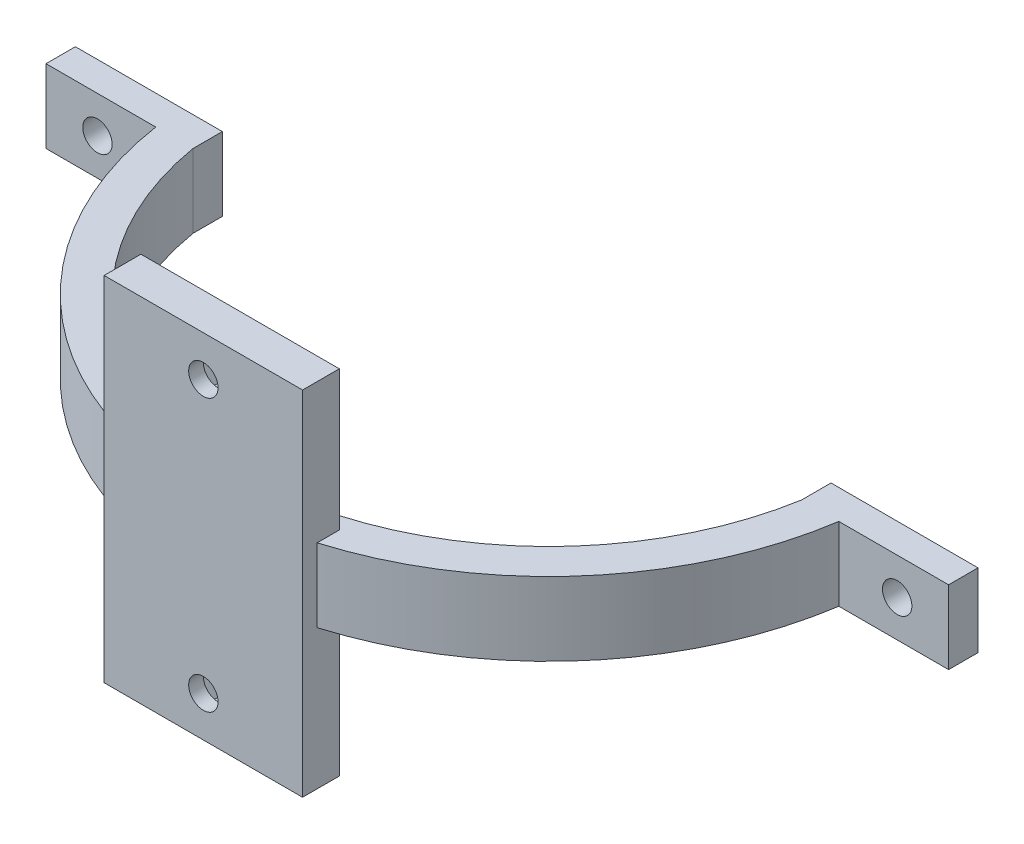
ISO-10303-21;
HEADER;
FILE_DESCRIPTION(('STEP AP214'),'2;1');
FILE_NAME('part.step','',(''),(''),'','','');
FILE_SCHEMA(('AUTOMOTIVE_DESIGN { 1 0 10303 214 1 1 1 1 }'));
ENDSEC;
DATA;
#1=APPLICATION_CONTEXT('core data for automotive mechanical design processes');
#2=APPLICATION_PROTOCOL_DEFINITION('international standard','automotive_design',2000,#1);
#3=PRODUCT_CONTEXT('',#1,'mechanical');
#4=PRODUCT('Part','Part','',(#3));
#5=PRODUCT_RELATED_PRODUCT_CATEGORY('part','',(#4));
#6=PRODUCT_DEFINITION_FORMATION('','',#4);
#7=PRODUCT_DEFINITION_CONTEXT('part definition',#1,'design');
#8=PRODUCT_DEFINITION('design','',#6,#7);
#9=PRODUCT_DEFINITION_SHAPE('','',#8);
#10=(LENGTH_UNIT() NAMED_UNIT(*) SI_UNIT(.MILLI.,.METRE.));
#11=(NAMED_UNIT(*) PLANE_ANGLE_UNIT() SI_UNIT($,.RADIAN.));
#12=(NAMED_UNIT(*) SI_UNIT($,.STERADIAN.) SOLID_ANGLE_UNIT());
#13=UNCERTAINTY_MEASURE_WITH_UNIT(LENGTH_MEASURE(1.E-05),#10,'distance_accuracy_value','');
#14=(GEOMETRIC_REPRESENTATION_CONTEXT(3) GLOBAL_UNCERTAINTY_ASSIGNED_CONTEXT((#13)) GLOBAL_UNIT_ASSIGNED_CONTEXT((#10,
#11,#12)) REPRESENTATION_CONTEXT('',''));
#15=CARTESIAN_POINT('',(0.,0.,0.));
#16=DIRECTION('',(0.,0.,1.));
#17=DIRECTION('',(1.,0.,0.));
#18=AXIS2_PLACEMENT_3D('',#15,#16,#17);
#19=CARTESIAN_POINT('',(0.,10.,0.));
#20=DIRECTION('',(0.,1.,0.));
#21=DIRECTION('',(0.,0.,1.));
#22=AXIS2_PLACEMENT_3D('',#19,#20,#21);
#23=PLANE('',#22);
#24=DIRECTION('',(0.,0.,1.));
#25=VECTOR('',#24,1.);
#26=CARTESIAN_POINT('',(-13.5,10.,47.));
#27=LINE('',#26,#25);
#28=CARTESIAN_POINT('',(-13.5,10.,42.));
#29=VERTEX_POINT('',#28);
#30=CARTESIAN_POINT('',(-13.5,10.,45.0194402452985));
#31=VERTEX_POINT('',#30);
#32=EDGE_CURVE('E334',#29,#31,#27,.T.);
#33=ORIENTED_EDGE('',*,*,#32,.F.);
#34=DIRECTION('',(-1.,0.,0.));
#35=VECTOR('',#34,1.);
#36=CARTESIAN_POINT('',(-13.5,10.,42.));
#37=LINE('',#36,#35);
#38=CARTESIAN_POINT('',(0.,10.,42.));
#39=VERTEX_POINT('',#38);
#40=EDGE_CURVE('E11',#39,#29,#37,.T.);
#41=ORIENTED_EDGE('',*,*,#40,.F.);
#42=CARTESIAN_POINT('',(0.,10.,0.));
#43=DIRECTION('',(0.,1.,0.));
#44=DIRECTION('',(0.,0.,1.));
#45=AXIS2_PLACEMENT_3D('',#42,#43,#44);
#46=CIRCLE('',#45,42.);
#47=CARTESIAN_POINT('',(-41.4125584816973,10.,6.99999999999999));
#48=VERTEX_POINT('',#47);
#49=EDGE_CURVE('E549',#48,#39,#46,.T.);
#50=ORIENTED_EDGE('',*,*,#49,.F.);
#51=DIRECTION('',(0.,0.,1.));
#52=VECTOR('',#51,1.);
#53=CARTESIAN_POINT('',(-41.4125584816973,10.,3.));
#54=LINE('',#53,#52);
#55=CARTESIAN_POINT('',(-41.4125584816973,10.,3.));
#56=VERTEX_POINT('',#55);
#57=EDGE_CURVE('E554',#56,#48,#54,.T.);
#58=ORIENTED_EDGE('',*,*,#57,.F.);
#59=DIRECTION('',(1.,0.,0.));
#60=VECTOR('',#59,1.);
#61=CARTESIAN_POINT('',(61.4125584816973,10.,3.));
#62=LINE('',#61,#60);
#63=CARTESIAN_POINT('',(-61.4125584816973,10.,3.));
#64=VERTEX_POINT('',#63);
#65=EDGE_CURVE('E503',#64,#56,#62,.T.);
#66=ORIENTED_EDGE('',*,*,#65,.F.);
#67=DIRECTION('',(0.,0.,1.));
#68=VECTOR('',#67,1.);
#69=CARTESIAN_POINT('',(-61.4125584816973,10.,3.));
#70=LINE('',#69,#68);
#71=CARTESIAN_POINT('',(-61.4125584816973,10.,7.));
#72=VERTEX_POINT('',#71);
#73=EDGE_CURVE('E446',#64,#72,#70,.T.);
#74=ORIENTED_EDGE('',*,*,#73,.T.);
#75=DIRECTION('',(1.,0.,0.));
#76=VECTOR('',#75,1.);
#77=CARTESIAN_POINT('',(61.4125584816973,10.,7.));
#78=LINE('',#77,#76);
#79=CARTESIAN_POINT('',(-46.475800154489,10.,7.));
#80=VERTEX_POINT('',#79);
#81=EDGE_CURVE('E428',#72,#80,#78,.T.);
#82=ORIENTED_EDGE('',*,*,#81,.T.);
#83=CARTESIAN_POINT('',(0.,10.,0.));
#84=DIRECTION('',(0.,1.,0.));
#85=DIRECTION('',(0.,0.,1.));
#86=AXIS2_PLACEMENT_3D('',#83,#84,#85);
#87=CIRCLE('',#86,47.);
#88=EDGE_CURVE('E456',#80,#31,#87,.T.);
#89=ORIENTED_EDGE('',*,*,#88,.T.);
#90=EDGE_LOOP('',(#33,#41,#50,#58,#66,#74,#82,#89));
#91=FACE_BOUND('',#90,.T.);
#92=ADVANCED_FACE('F33',(#91),#23,.T.);
#93=CARTESIAN_POINT('',(0.,0.,0.));
#94=DIRECTION('',(0.,1.,0.));
#95=DIRECTION('',(0.,0.,1.));
#96=AXIS2_PLACEMENT_3D('',#93,#94,#95);
#97=PLANE('',#96);
#98=CARTESIAN_POINT('',(0.,0.,0.));
#99=DIRECTION('',(0.,1.,0.));
#100=DIRECTION('',(0.,0.,1.));
#101=AXIS2_PLACEMENT_3D('',#98,#99,#100);
#102=CIRCLE('',#101,42.);
#103=CARTESIAN_POINT('',(0.,0.,42.));
#104=VERTEX_POINT('',#103);
#105=CARTESIAN_POINT('',(41.4125584816973,0.,6.99999999999998));
#106=VERTEX_POINT('',#105);
#107=EDGE_CURVE('E542',#104,#106,#102,.T.);
#108=ORIENTED_EDGE('',*,*,#107,.T.);
#109=DIRECTION('',(0.,0.,-1.));
#110=VECTOR('',#109,1.);
#111=CARTESIAN_POINT('',(41.4125584816973,0.,0.));
#112=LINE('',#111,#110);
#113=CARTESIAN_POINT('',(41.4125584816973,0.,3.));
#114=VERTEX_POINT('',#113);
#115=EDGE_CURVE('E497',#106,#114,#112,.T.);
#116=ORIENTED_EDGE('',*,*,#115,.T.);
#117=DIRECTION('',(-1.,0.,0.));
#118=VECTOR('',#117,1.);
#119=CARTESIAN_POINT('',(-61.4125584816973,0.,3.));
#120=LINE('',#119,#118);
#121=CARTESIAN_POINT('',(61.4125584816973,0.,3.));
#122=VERTEX_POINT('',#121);
#123=EDGE_CURVE('E441',#122,#114,#120,.T.);
#124=ORIENTED_EDGE('',*,*,#123,.F.);
#125=DIRECTION('',(0.,0.,1.));
#126=VECTOR('',#125,1.);
#127=CARTESIAN_POINT('',(61.4125584816973,0.,3.));
#128=LINE('',#127,#126);
#129=CARTESIAN_POINT('',(61.4125584816973,0.,7.));
#130=VERTEX_POINT('',#129);
#131=EDGE_CURVE('E440',#122,#130,#128,.T.);
#132=ORIENTED_EDGE('',*,*,#131,.T.);
#133=DIRECTION('',(-1.,0.,0.));
#134=VECTOR('',#133,1.);
#135=CARTESIAN_POINT('',(-61.4125584816973,0.,7.));
#136=LINE('',#135,#134);
#137=CARTESIAN_POINT('',(46.475800154489,0.,7.));
#138=VERTEX_POINT('',#137);
#139=EDGE_CURVE('E422',#130,#138,#136,.T.);
#140=ORIENTED_EDGE('',*,*,#139,.T.);
#141=CARTESIAN_POINT('',(0.,0.,0.));
#142=DIRECTION('',(0.,1.,0.));
#143=DIRECTION('',(0.,0.,1.));
#144=AXIS2_PLACEMENT_3D('',#141,#142,#143);
#145=CIRCLE('',#144,47.);
#146=CARTESIAN_POINT('',(13.5,0.,45.0194402452985));
#147=VERTEX_POINT('',#146);
#148=EDGE_CURVE('E473',#147,#138,#145,.T.);
#149=ORIENTED_EDGE('',*,*,#148,.F.);
#150=DIRECTION('',(0.,0.,1.));
#151=VECTOR('',#150,1.);
#152=CARTESIAN_POINT('',(13.5,0.,47.));
#153=LINE('',#152,#151);
#154=CARTESIAN_POINT('',(13.5,0.,42.));
#155=VERTEX_POINT('',#154);
#156=EDGE_CURVE('E492',#155,#147,#153,.T.);
#157=ORIENTED_EDGE('',*,*,#156,.F.);
#158=DIRECTION('',(1.,0.,0.));
#159=VECTOR('',#158,1.);
#160=CARTESIAN_POINT('',(13.5,0.,42.));
#161=LINE('',#160,#159);
#162=EDGE_CURVE('E496',#104,#155,#161,.T.);
#163=ORIENTED_EDGE('',*,*,#162,.F.);
#164=EDGE_LOOP('',(#108,#116,#124,#132,#140,#149,#157,#163));
#165=FACE_BOUND('',#164,.T.);
#166=ADVANCED_FACE('F583',(#165),#97,.F.);
#167=CARTESIAN_POINT('',(0.,0.,3.));
#168=DIRECTION('',(0.,0.,1.));
#169=DIRECTION('',(1.,0.,0.));
#170=AXIS2_PLACEMENT_3D('',#167,#168,#169);
#171=PLANE('',#170);
#172=CARTESIAN_POINT('',(54.4125584816973,5.,3.));
#173=DIRECTION('',(0.,0.,1.));
#174=DIRECTION('',(1.,0.,0.));
#175=AXIS2_PLACEMENT_3D('',#172,#173,#174);
#176=CIRCLE('',#175,1.99999999999999);
#177=CARTESIAN_POINT('',(56.4125584816973,5.,3.));
#178=VERTEX_POINT('',#177);
#179=EDGE_CURVE('E385',#178,#178,#176,.T.);
#180=ORIENTED_EDGE('',*,*,#179,.T.);
#181=EDGE_LOOP('',(#180));
#182=FACE_BOUND('',#181,.T.);
#183=ORIENTED_EDGE('',*,*,#123,.T.);
#184=DIRECTION('',(0.,1.,0.));
#185=VECTOR('',#184,1.);
#186=CARTESIAN_POINT('',(41.4125584816973,0.,3.));
#187=LINE('',#186,#185);
#188=CARTESIAN_POINT('',(41.4125584816973,10.,3.));
#189=VERTEX_POINT('',#188);
#190=EDGE_CURVE('E369',#114,#189,#187,.T.);
#191=ORIENTED_EDGE('',*,*,#190,.T.);
#192=CARTESIAN_POINT('',(61.4125584816973,10.,3.));
#193=VERTEX_POINT('',#192);
#194=EDGE_CURVE('E502',#189,#193,#62,.T.);
#195=ORIENTED_EDGE('',*,*,#194,.T.);
#196=DIRECTION('',(0.,-1.,0.));
#197=VECTOR('',#196,1.);
#198=CARTESIAN_POINT('',(61.4125584816973,0.,3.));
#199=LINE('',#198,#197);
#200=EDGE_CURVE('E506',#193,#122,#199,.T.);
#201=ORIENTED_EDGE('',*,*,#200,.T.);
#202=EDGE_LOOP('',(#183,#191,#195,#201));
#203=FACE_BOUND('',#202,.T.);
#204=ADVANCED_FACE('F569',(#182,#203),#171,.F.);
#205=DIRECTION('',(0.,0.,1.));
#206=VECTOR('',#205,1.);
#207=CARTESIAN_POINT('',(-41.4125584816973,0.,0.));
#208=LINE('',#207,#206);
#209=CARTESIAN_POINT('',(-41.4125584816973,0.,3.));
#210=VERTEX_POINT('',#209);
#211=CARTESIAN_POINT('',(-41.4125584816973,0.,6.99999999999999));
#212=VERTEX_POINT('',#211);
#213=EDGE_CURVE('E539',#210,#212,#208,.T.);
#214=ORIENTED_EDGE('',*,*,#213,.T.);
#215=EDGE_CURVE('E543',#212,#104,#102,.T.);
#216=ORIENTED_EDGE('',*,*,#215,.T.);
#217=CARTESIAN_POINT('',(-13.5,0.,42.));
#218=VERTEX_POINT('',#217);
#219=EDGE_CURVE('E528',#218,#104,#161,.T.);
#220=ORIENTED_EDGE('',*,*,#219,.F.);
#221=DIRECTION('',(0.,0.,-1.));
#222=VECTOR('',#221,1.);
#223=CARTESIAN_POINT('',(-13.5,0.,42.));
#224=LINE('',#223,#222);
#225=CARTESIAN_POINT('',(-13.5,0.,45.0194402452985));
#226=VERTEX_POINT('',#225);
#227=EDGE_CURVE('E467',#226,#218,#224,.T.);
#228=ORIENTED_EDGE('',*,*,#227,.F.);
#229=CARTESIAN_POINT('',(0.,0.,0.));
#230=DIRECTION('',(0.,1.,0.));
#231=DIRECTION('',(0.,0.,1.));
#232=AXIS2_PLACEMENT_3D('',#229,#230,#231);
#233=CIRCLE('',#232,47.);
#234=CARTESIAN_POINT('',(-46.475800154489,0.,7.));
#235=VERTEX_POINT('',#234);
#236=EDGE_CURVE('E470',#235,#226,#233,.T.);
#237=ORIENTED_EDGE('',*,*,#236,.F.);
#238=CARTESIAN_POINT('',(-61.4125584816973,0.,7.));
#239=VERTEX_POINT('',#238);
#240=EDGE_CURVE('E413',#235,#239,#136,.T.);
#241=ORIENTED_EDGE('',*,*,#240,.T.);
#242=DIRECTION('',(0.,0.,1.));
#243=VECTOR('',#242,1.);
#244=CARTESIAN_POINT('',(-61.4125584816973,0.,3.));
#245=LINE('',#244,#243);
#246=CARTESIAN_POINT('',(-61.4125584816973,0.,3.));
#247=VERTEX_POINT('',#246);
#248=EDGE_CURVE('E437',#247,#239,#245,.T.);
#249=ORIENTED_EDGE('',*,*,#248,.F.);
#250=EDGE_CURVE('E508',#210,#247,#120,.T.);
#251=ORIENTED_EDGE('',*,*,#250,.F.);
#252=EDGE_LOOP('',(#214,#216,#220,#228,#237,#241,#249,#251));
#253=FACE_BOUND('',#252,.T.);
#254=ADVANCED_FACE('F629',(#253),#97,.F.);
#255=CARTESIAN_POINT('',(0.,0.,0.));
#256=DIRECTION('',(0.,1.,0.));
#257=DIRECTION('',(0.,0.,1.));
#258=AXIS2_PLACEMENT_3D('',#255,#256,#257);
#259=CYLINDRICAL_SURFACE('',#258,47.);
#260=ORIENTED_EDGE('',*,*,#88,.F.);
#261=DIRECTION('',(0.,1.,0.));
#262=VECTOR('',#261,1.);
#263=CARTESIAN_POINT('',(-46.475800154489,0.,7.));
#264=LINE('',#263,#262);
#265=EDGE_CURVE('E414',#235,#80,#264,.T.);
#266=ORIENTED_EDGE('',*,*,#265,.F.);
#267=ORIENTED_EDGE('',*,*,#236,.T.);
#268=DIRECTION('',(0.,1.,0.));
#269=VECTOR('',#268,1.);
#270=CARTESIAN_POINT('',(-13.5,0.,45.0194402452985));
#271=LINE('',#270,#269);
#272=EDGE_CURVE('E480',#226,#31,#271,.T.);
#273=ORIENTED_EDGE('',*,*,#272,.T.);
#274=EDGE_LOOP('',(#260,#266,#267,#273));
#275=FACE_BOUND('',#274,.T.);
#276=ADVANCED_FACE('F35',(#275),#259,.T.);
#277=CARTESIAN_POINT('',(0.,0.,0.));
#278=DIRECTION('',(0.,1.,0.));
#279=DIRECTION('',(0.,0.,1.));
#280=AXIS2_PLACEMENT_3D('',#277,#278,#279);
#281=CYLINDRICAL_SURFACE('',#280,47.);
#282=CARTESIAN_POINT('',(0.,10.,0.));
#283=DIRECTION('',(0.,1.,0.));
#284=DIRECTION('',(0.,0.,1.));
#285=AXIS2_PLACEMENT_3D('',#282,#283,#284);
#286=CIRCLE('',#285,47.);
#287=CARTESIAN_POINT('',(13.5,10.,45.0194402452985));
#288=VERTEX_POINT('',#287);
#289=CARTESIAN_POINT('',(46.475800154489,10.,7.));
#290=VERTEX_POINT('',#289);
#291=EDGE_CURVE('E474',#288,#290,#286,.T.);
#292=ORIENTED_EDGE('',*,*,#291,.F.);
#293=DIRECTION('',(0.,1.,0.));
#294=VECTOR('',#293,1.);
#295=CARTESIAN_POINT('',(13.5,0.,45.0194402452985));
#296=LINE('',#295,#294);
#297=EDGE_CURVE('E478',#147,#288,#296,.T.);
#298=ORIENTED_EDGE('',*,*,#297,.F.);
#299=ORIENTED_EDGE('',*,*,#148,.T.);
#300=DIRECTION('',(0.,1.,0.));
#301=VECTOR('',#300,1.);
#302=CARTESIAN_POINT('',(46.475800154489,0.,7.));
#303=LINE('',#302,#301);
#304=EDGE_CURVE('E468',#138,#290,#303,.T.);
#305=ORIENTED_EDGE('',*,*,#304,.T.);
#306=EDGE_LOOP('',(#292,#298,#299,#305));
#307=FACE_BOUND('',#306,.T.);
#308=ADVANCED_FACE('F607',(#307),#281,.T.);
#309=CARTESIAN_POINT('',(13.5,10.,42.));
#310=VERTEX_POINT('',#309);
#311=EDGE_CURVE('E44',#310,#39,#37,.T.);
#312=ORIENTED_EDGE('',*,*,#311,.F.);
#313=DIRECTION('',(0.,0.,-1.));
#314=VECTOR('',#313,1.);
#315=CARTESIAN_POINT('',(13.5,10.,42.));
#316=LINE('',#315,#314);
#317=EDGE_CURVE('E42',#288,#310,#316,.T.);
#318=ORIENTED_EDGE('',*,*,#317,.F.);
#319=ORIENTED_EDGE('',*,*,#291,.T.);
#320=CARTESIAN_POINT('',(61.4125584816973,10.,7.));
#321=VERTEX_POINT('',#320);
#322=EDGE_CURVE('E458',#290,#321,#78,.T.);
#323=ORIENTED_EDGE('',*,*,#322,.T.);
#324=DIRECTION('',(0.,0.,1.));
#325=VECTOR('',#324,1.);
#326=CARTESIAN_POINT('',(61.4125584816973,10.,3.));
#327=LINE('',#326,#325);
#328=EDGE_CURVE('E444',#193,#321,#327,.T.);
#329=ORIENTED_EDGE('',*,*,#328,.F.);
#330=ORIENTED_EDGE('',*,*,#194,.F.);
#331=DIRECTION('',(0.,0.,-1.));
#332=VECTOR('',#331,1.);
#333=CARTESIAN_POINT('',(41.4125584816973,10.,6.99999999999999));
#334=LINE('',#333,#332);
#335=CARTESIAN_POINT('',(41.4125584816973,10.,6.99999999999998));
#336=VERTEX_POINT('',#335);
#337=EDGE_CURVE('E361',#336,#189,#334,.T.);
#338=ORIENTED_EDGE('',*,*,#337,.F.);
#339=EDGE_CURVE('E553',#39,#336,#46,.T.);
#340=ORIENTED_EDGE('',*,*,#339,.F.);
#341=EDGE_LOOP('',(#312,#318,#319,#323,#329,#330,#338,#340));
#342=FACE_BOUND('',#341,.T.);
#343=ADVANCED_FACE('F573',(#342),#23,.T.);
#344=CARTESIAN_POINT('',(13.5,10.,47.));
#345=DIRECTION('',(-1.,0.,0.));
#346=DIRECTION('',(0.,0.,1.));
#347=AXIS2_PLACEMENT_3D('',#344,#345,#346);
#348=PLANE('',#347);
#349=ORIENTED_EDGE('',*,*,#297,.T.);
#350=ORIENTED_EDGE('',*,*,#317,.T.);
#351=DIRECTION('',(0.,-1.,0.));
#352=VECTOR('',#351,1.);
#353=CARTESIAN_POINT('',(13.5,29.,42.));
#354=LINE('',#353,#352);
#355=CARTESIAN_POINT('',(13.5,29.,42.));
#356=VERTEX_POINT('',#355);
#357=EDGE_CURVE('E358',#356,#310,#354,.T.);
#358=ORIENTED_EDGE('',*,*,#357,.F.);
#359=DIRECTION('',(0.,0.,-1.));
#360=VECTOR('',#359,1.);
#361=CARTESIAN_POINT('',(13.5,29.,42.));
#362=LINE('',#361,#360);
#363=CARTESIAN_POINT('',(13.5,29.,47.));
#364=VERTEX_POINT('',#363);
#365=EDGE_CURVE('E350',#364,#356,#362,.T.);
#366=ORIENTED_EDGE('',*,*,#365,.F.);
#367=DIRECTION('',(0.,1.,0.));
#368=VECTOR('',#367,1.);
#369=CARTESIAN_POINT('',(13.5,10.,47.));
#370=LINE('',#369,#368);
#371=CARTESIAN_POINT('',(13.5,-19.,47.));
#372=VERTEX_POINT('',#371);
#373=EDGE_CURVE('E448',#372,#364,#370,.T.);
#374=ORIENTED_EDGE('',*,*,#373,.F.);
#375=DIRECTION('',(0.,0.,1.));
#376=VECTOR('',#375,1.);
#377=CARTESIAN_POINT('',(13.5,-19.,47.));
#378=LINE('',#377,#376);
#379=CARTESIAN_POINT('',(13.5,-19.,42.));
#380=VERTEX_POINT('',#379);
#381=EDGE_CURVE('E529',#380,#372,#378,.T.);
#382=ORIENTED_EDGE('',*,*,#381,.F.);
#383=DIRECTION('',(0.,1.,0.));
#384=VECTOR('',#383,1.);
#385=CARTESIAN_POINT('',(13.5,-19.,42.));
#386=LINE('',#385,#384);
#387=EDGE_CURVE('E515',#380,#155,#386,.T.);
#388=ORIENTED_EDGE('',*,*,#387,.T.);
#389=ORIENTED_EDGE('',*,*,#156,.T.);
#390=EDGE_LOOP('',(#349,#350,#358,#366,#374,#382,#388,#389));
#391=FACE_BOUND('',#390,.T.);
#392=ADVANCED_FACE('F591',(#391),#348,.F.);
#393=CARTESIAN_POINT('',(-13.5,0.,47.));
#394=DIRECTION('',(1.,0.,0.));
#395=DIRECTION('',(0.,0.,-1.));
#396=AXIS2_PLACEMENT_3D('',#393,#394,#395);
#397=PLANE('',#396);
#398=ORIENTED_EDGE('',*,*,#272,.F.);
#399=ORIENTED_EDGE('',*,*,#227,.T.);
#400=DIRECTION('',(0.,1.,0.));
#401=VECTOR('',#400,1.);
#402=CARTESIAN_POINT('',(-13.5,-19.,42.));
#403=LINE('',#402,#401);
#404=CARTESIAN_POINT('',(-13.5,-19.,42.));
#405=VERTEX_POINT('',#404);
#406=EDGE_CURVE('E498',#405,#218,#403,.T.);
#407=ORIENTED_EDGE('',*,*,#406,.F.);
#408=DIRECTION('',(0.,0.,-1.));
#409=VECTOR('',#408,1.);
#410=CARTESIAN_POINT('',(-13.5,-19.,42.));
#411=LINE('',#410,#409);
#412=CARTESIAN_POINT('',(-13.5,-19.,47.));
#413=VERTEX_POINT('',#412);
#414=EDGE_CURVE('E525',#413,#405,#411,.T.);
#415=ORIENTED_EDGE('',*,*,#414,.F.);
#416=DIRECTION('',(0.,-1.,0.));
#417=VECTOR('',#416,1.);
#418=CARTESIAN_POINT('',(-13.5,0.,47.));
#419=LINE('',#418,#417);
#420=CARTESIAN_POINT('',(-13.5,29.,47.));
#421=VERTEX_POINT('',#420);
#422=EDGE_CURVE('E451',#421,#413,#419,.T.);
#423=ORIENTED_EDGE('',*,*,#422,.F.);
#424=DIRECTION('',(0.,0.,1.));
#425=VECTOR('',#424,1.);
#426=CARTESIAN_POINT('',(-13.5,29.,47.));
#427=LINE('',#426,#425);
#428=CARTESIAN_POINT('',(-13.5,29.,42.));
#429=VERTEX_POINT('',#428);
#430=EDGE_CURVE('E344',#429,#421,#427,.T.);
#431=ORIENTED_EDGE('',*,*,#430,.F.);
#432=DIRECTION('',(0.,-1.,0.));
#433=VECTOR('',#432,1.);
#434=CARTESIAN_POINT('',(-13.5,29.,42.));
#435=LINE('',#434,#433);
#436=EDGE_CURVE('E353',#429,#29,#435,.T.);
#437=ORIENTED_EDGE('',*,*,#436,.T.);
#438=ORIENTED_EDGE('',*,*,#32,.T.);
#439=EDGE_LOOP('',(#398,#399,#407,#415,#423,#431,#437,#438));
#440=FACE_BOUND('',#439,.T.);
#441=ADVANCED_FACE('F617',(#440),#397,.F.);
#442=CARTESIAN_POINT('',(0.,0.,47.));
#443=DIRECTION('',(0.,0.,-1.));
#444=DIRECTION('',(-1.,0.,0.));
#445=AXIS2_PLACEMENT_3D('',#442,#443,#444);
#446=PLANE('',#445);
#447=CARTESIAN_POINT('',(0.,23.5,47.));
#448=DIRECTION('',(0.,0.,1.));
#449=DIRECTION('',(1.,0.,0.));
#450=AXIS2_PLACEMENT_3D('',#447,#448,#449);
#451=CIRCLE('',#450,1.99999999999999);
#452=CARTESIAN_POINT('',(1.99999999999998,23.5,47.));
#453=VERTEX_POINT('',#452);
#454=EDGE_CURVE('E381',#453,#453,#451,.T.);
#455=ORIENTED_EDGE('',*,*,#454,.F.);
#456=EDGE_LOOP('',(#455));
#457=FACE_BOUND('',#456,.T.);
#458=CARTESIAN_POINT('',(0.,-13.5,47.));
#459=DIRECTION('',(0.,0.,1.));
#460=DIRECTION('',(1.,0.,0.));
#461=AXIS2_PLACEMENT_3D('',#458,#459,#460);
#462=CIRCLE('',#461,1.99999999999999);
#463=CARTESIAN_POINT('',(1.99999999999999,-13.5,47.));
#464=VERTEX_POINT('',#463);
#465=EDGE_CURVE('E266',#464,#464,#462,.T.);
#466=ORIENTED_EDGE('',*,*,#465,.F.);
#467=EDGE_LOOP('',(#466));
#468=FACE_BOUND('',#467,.T.);
#469=ORIENTED_EDGE('',*,*,#373,.T.);
#470=DIRECTION('',(1.,0.,0.));
#471=VECTOR('',#470,1.);
#472=CARTESIAN_POINT('',(13.5,29.,47.));
#473=LINE('',#472,#471);
#474=EDGE_CURVE('E347',#421,#364,#473,.T.);
#475=ORIENTED_EDGE('',*,*,#474,.F.);
#476=ORIENTED_EDGE('',*,*,#422,.T.);
#477=DIRECTION('',(-1.,0.,0.));
#478=VECTOR('',#477,1.);
#479=CARTESIAN_POINT('',(-13.5,-19.,47.));
#480=LINE('',#479,#478);
#481=EDGE_CURVE('E532',#372,#413,#480,.T.);
#482=ORIENTED_EDGE('',*,*,#481,.F.);
#483=EDGE_LOOP('',(#469,#475,#476,#482));
#484=FACE_BOUND('',#483,.T.);
#485=ADVANCED_FACE('F599',(#457,#468,#484),#446,.F.);
#486=CARTESIAN_POINT('',(0.,0.,7.));
#487=DIRECTION('',(0.,0.,1.));
#488=DIRECTION('',(1.,0.,0.));
#489=AXIS2_PLACEMENT_3D('',#486,#487,#488);
#490=PLANE('',#489);
#491=CARTESIAN_POINT('',(54.4125584816973,5.,7.));
#492=DIRECTION('',(0.,0.,1.));
#493=DIRECTION('',(1.,0.,0.));
#494=AXIS2_PLACEMENT_3D('',#491,#492,#493);
#495=CIRCLE('',#494,1.99999999999999);
#496=CARTESIAN_POINT('',(56.4125584816973,5.,7.));
#497=VERTEX_POINT('',#496);
#498=EDGE_CURVE('E389',#497,#497,#495,.T.);
#499=ORIENTED_EDGE('',*,*,#498,.F.);
#500=EDGE_LOOP('',(#499));
#501=FACE_BOUND('',#500,.T.);
#502=ORIENTED_EDGE('',*,*,#304,.F.);
#503=ORIENTED_EDGE('',*,*,#139,.F.);
#504=DIRECTION('',(0.,-1.,0.));
#505=VECTOR('',#504,1.);
#506=CARTESIAN_POINT('',(61.4125584816973,0.,7.));
#507=LINE('',#506,#505);
#508=EDGE_CURVE('E423',#321,#130,#507,.T.);
#509=ORIENTED_EDGE('',*,*,#508,.F.);
#510=ORIENTED_EDGE('',*,*,#322,.F.);
#511=EDGE_LOOP('',(#502,#503,#509,#510));
#512=FACE_BOUND('',#511,.T.);
#513=ADVANCED_FACE('F409',(#501,#512),#490,.T.);
#514=CARTESIAN_POINT('',(-61.4125584816973,10.,3.));
#515=DIRECTION('',(1.,0.,0.));
#516=DIRECTION('',(0.,0.,-1.));
#517=AXIS2_PLACEMENT_3D('',#514,#515,#516);
#518=PLANE('',#517);
#519=DIRECTION('',(0.,1.,0.));
#520=VECTOR('',#519,1.);
#521=CARTESIAN_POINT('',(-61.4125584816973,10.,7.));
#522=LINE('',#521,#520);
#523=EDGE_CURVE('E417',#239,#72,#522,.T.);
#524=ORIENTED_EDGE('',*,*,#523,.T.);
#525=ORIENTED_EDGE('',*,*,#73,.F.);
#526=DIRECTION('',(0.,1.,0.));
#527=VECTOR('',#526,1.);
#528=CARTESIAN_POINT('',(-61.4125584816973,10.,3.));
#529=LINE('',#528,#527);
#530=EDGE_CURVE('E426',#247,#64,#529,.T.);
#531=ORIENTED_EDGE('',*,*,#530,.F.);
#532=ORIENTED_EDGE('',*,*,#248,.T.);
#533=EDGE_LOOP('',(#524,#525,#531,#532));
#534=FACE_BOUND('',#533,.T.);
#535=ADVANCED_FACE('F610',(#534),#518,.F.);
#536=CARTESIAN_POINT('',(61.4125584816973,0.,3.));
#537=DIRECTION('',(-1.,0.,0.));
#538=DIRECTION('',(0.,0.,1.));
#539=AXIS2_PLACEMENT_3D('',#536,#537,#538);
#540=PLANE('',#539);
#541=ORIENTED_EDGE('',*,*,#508,.T.);
#542=ORIENTED_EDGE('',*,*,#131,.F.);
#543=ORIENTED_EDGE('',*,*,#200,.F.);
#544=ORIENTED_EDGE('',*,*,#328,.T.);
#545=EDGE_LOOP('',(#541,#542,#543,#544));
#546=FACE_BOUND('',#545,.T.);
#547=ADVANCED_FACE('F579',(#546),#540,.F.);
#548=CARTESIAN_POINT('',(-54.4125584816973,5.,3.));
#549=DIRECTION('',(0.,0.,1.));
#550=DIRECTION('',(1.,0.,0.));
#551=AXIS2_PLACEMENT_3D('',#548,#549,#550);
#552=CIRCLE('',#551,1.99999999999999);
#553=CARTESIAN_POINT('',(-52.4125584816973,5.,3.));
#554=VERTEX_POINT('',#553);
#555=EDGE_CURVE('E394',#554,#554,#552,.T.);
#556=ORIENTED_EDGE('',*,*,#555,.T.);
#557=EDGE_LOOP('',(#556));
#558=FACE_BOUND('',#557,.T.);
#559=ORIENTED_EDGE('',*,*,#65,.T.);
#560=DIRECTION('',(0.,-1.,0.));
#561=VECTOR('',#560,1.);
#562=CARTESIAN_POINT('',(-41.4125584816973,0.,3.));
#563=LINE('',#562,#561);
#564=EDGE_CURVE('E572',#56,#210,#563,.T.);
#565=ORIENTED_EDGE('',*,*,#564,.T.);
#566=ORIENTED_EDGE('',*,*,#250,.T.);
#567=ORIENTED_EDGE('',*,*,#530,.T.);
#568=EDGE_LOOP('',(#559,#565,#566,#567));
#569=FACE_BOUND('',#568,.T.);
#570=ADVANCED_FACE('F407',(#558,#569),#171,.F.);
#571=CARTESIAN_POINT('',(-54.4125584816973,5.,7.));
#572=DIRECTION('',(0.,0.,1.));
#573=DIRECTION('',(1.,0.,0.));
#574=AXIS2_PLACEMENT_3D('',#571,#572,#573);
#575=CIRCLE('',#574,1.99999999999999);
#576=CARTESIAN_POINT('',(-52.4125584816973,5.,7.));
#577=VERTEX_POINT('',#576);
#578=EDGE_CURVE('E397',#577,#577,#575,.T.);
#579=ORIENTED_EDGE('',*,*,#578,.F.);
#580=EDGE_LOOP('',(#579));
#581=FACE_BOUND('',#580,.T.);
#582=ORIENTED_EDGE('',*,*,#240,.F.);
#583=ORIENTED_EDGE('',*,*,#265,.T.);
#584=ORIENTED_EDGE('',*,*,#81,.F.);
#585=ORIENTED_EDGE('',*,*,#523,.F.);
#586=EDGE_LOOP('',(#582,#583,#584,#585));
#587=FACE_BOUND('',#586,.T.);
#588=ADVANCED_FACE('F403',(#581,#587),#490,.T.);
#589=CARTESIAN_POINT('',(13.5,-19.,42.));
#590=DIRECTION('',(0.,0.,1.));
#591=DIRECTION('',(1.,0.,0.));
#592=AXIS2_PLACEMENT_3D('',#589,#590,#591);
#593=PLANE('',#592);
#594=DIRECTION('',(1.,0.,0.));
#595=VECTOR('',#594,1.);
#596=CARTESIAN_POINT('',(-1.99185842870421,-10.05,42.));
#597=LINE('',#596,#595);
#598=CARTESIAN_POINT('',(-1.99185842870421,-10.05,42.));
#599=VERTEX_POINT('',#598);
#600=CARTESIAN_POINT('',(1.99185842870421,-10.05,42.));
#601=VERTEX_POINT('',#600);
#602=EDGE_CURVE('E277',#599,#601,#597,.T.);
#603=ORIENTED_EDGE('',*,*,#602,.F.);
#604=DIRECTION('',(0.5,0.866025403784439,0.));
#605=VECTOR('',#604,1.);
#606=CARTESIAN_POINT('',(-3.98371685740842,-13.5,42.));
#607=LINE('',#606,#605);
#608=CARTESIAN_POINT('',(-3.98371685740842,-13.5,42.));
#609=VERTEX_POINT('',#608);
#610=EDGE_CURVE('E51',#609,#599,#607,.T.);
#611=ORIENTED_EDGE('',*,*,#610,.F.);
#612=DIRECTION('',(-0.5,0.866025403784439,0.));
#613=VECTOR('',#612,1.);
#614=CARTESIAN_POINT('',(-1.99185842870421,-16.95,42.));
#615=LINE('',#614,#613);
#616=CARTESIAN_POINT('',(-1.99185842870421,-16.95,42.));
#617=VERTEX_POINT('',#616);
#618=EDGE_CURVE('E260',#617,#609,#615,.T.);
#619=ORIENTED_EDGE('',*,*,#618,.F.);
#620=DIRECTION('',(-1.,0.,0.));
#621=VECTOR('',#620,1.);
#622=CARTESIAN_POINT('',(1.99185842870421,-16.95,42.));
#623=LINE('',#622,#621);
#624=CARTESIAN_POINT('',(1.99185842870421,-16.95,42.));
#625=VERTEX_POINT('',#624);
#626=EDGE_CURVE('E263',#625,#617,#623,.T.);
#627=ORIENTED_EDGE('',*,*,#626,.F.);
#628=DIRECTION('',(-0.5,-0.866025403784439,0.));
#629=VECTOR('',#628,1.);
#630=CARTESIAN_POINT('',(3.98371685740843,-13.5,42.));
#631=LINE('',#630,#629);
#632=CARTESIAN_POINT('',(3.98371685740843,-13.5,42.));
#633=VERTEX_POINT('',#632);
#634=EDGE_CURVE('E283',#633,#625,#631,.T.);
#635=ORIENTED_EDGE('',*,*,#634,.F.);
#636=DIRECTION('',(0.5,-0.866025403784439,0.));
#637=VECTOR('',#636,1.);
#638=CARTESIAN_POINT('',(1.99185842870421,-10.05,42.));
#639=LINE('',#638,#637);
#640=EDGE_CURVE('E280',#601,#633,#639,.T.);
#641=ORIENTED_EDGE('',*,*,#640,.F.);
#642=EDGE_LOOP('',(#603,#611,#619,#627,#635,#641));
#643=FACE_BOUND('',#642,.T.);
#644=ORIENTED_EDGE('',*,*,#387,.F.);
#645=DIRECTION('',(1.,0.,0.));
#646=VECTOR('',#645,1.);
#647=CARTESIAN_POINT('',(13.5,-19.,42.));
#648=LINE('',#647,#646);
#649=EDGE_CURVE('E521',#405,#380,#648,.T.);
#650=ORIENTED_EDGE('',*,*,#649,.F.);
#651=ORIENTED_EDGE('',*,*,#406,.T.);
#652=ORIENTED_EDGE('',*,*,#219,.T.);
#653=ORIENTED_EDGE('',*,*,#162,.T.);
#654=EDGE_LOOP('',(#644,#650,#651,#652,#653));
#655=FACE_BOUND('',#654,.T.);
#656=ADVANCED_FACE('F406',(#643,#655),#593,.F.);
#657=CARTESIAN_POINT('',(0.,-19.,0.));
#658=DIRECTION('',(0.,1.,0.));
#659=DIRECTION('',(0.,0.,1.));
#660=AXIS2_PLACEMENT_3D('',#657,#658,#659);
#661=PLANE('',#660);
#662=ORIENTED_EDGE('',*,*,#381,.T.);
#663=ORIENTED_EDGE('',*,*,#481,.T.);
#664=ORIENTED_EDGE('',*,*,#414,.T.);
#665=ORIENTED_EDGE('',*,*,#649,.T.);
#666=EDGE_LOOP('',(#662,#663,#664,#665));
#667=FACE_BOUND('',#666,.T.);
#668=ADVANCED_FACE('F602',(#667),#661,.F.);
#669=CARTESIAN_POINT('',(41.4125584816973,-19.,6.99999999999999));
#670=DIRECTION('',(1.,0.,0.));
#671=DIRECTION('',(0.,0.,-1.));
#672=AXIS2_PLACEMENT_3D('',#669,#670,#671);
#673=PLANE('',#672);
#674=DIRECTION('',(0.,1.,0.));
#675=VECTOR('',#674,1.);
#676=CARTESIAN_POINT('',(41.4125584816973,-19.,6.99999999999998));
#677=LINE('',#676,#675);
#678=EDGE_CURVE('E546',#106,#336,#677,.T.);
#679=ORIENTED_EDGE('',*,*,#678,.T.);
#680=ORIENTED_EDGE('',*,*,#337,.T.);
#681=ORIENTED_EDGE('',*,*,#190,.F.);
#682=ORIENTED_EDGE('',*,*,#115,.F.);
#683=EDGE_LOOP('',(#679,#680,#681,#682));
#684=FACE_BOUND('',#683,.T.);
#685=ADVANCED_FACE('F563',(#684),#673,.F.);
#686=CARTESIAN_POINT('',(-41.4125584816973,-19.,3.));
#687=DIRECTION('',(-1.,0.,0.));
#688=DIRECTION('',(0.,0.,1.));
#689=AXIS2_PLACEMENT_3D('',#686,#687,#688);
#690=PLANE('',#689);
#691=ORIENTED_EDGE('',*,*,#564,.F.);
#692=ORIENTED_EDGE('',*,*,#57,.T.);
#693=DIRECTION('',(0.,1.,0.));
#694=VECTOR('',#693,1.);
#695=CARTESIAN_POINT('',(-41.4125584816973,-19.,6.99999999999999));
#696=LINE('',#695,#694);
#697=EDGE_CURVE('E547',#212,#48,#696,.T.);
#698=ORIENTED_EDGE('',*,*,#697,.F.);
#699=ORIENTED_EDGE('',*,*,#213,.F.);
#700=EDGE_LOOP('',(#691,#692,#698,#699));
#701=FACE_BOUND('',#700,.T.);
#702=ADVANCED_FACE('F657',(#701),#690,.F.);
#703=CARTESIAN_POINT('',(0.,-19.,0.));
#704=DIRECTION('',(0.,1.,0.));
#705=DIRECTION('',(0.,0.,1.));
#706=AXIS2_PLACEMENT_3D('',#703,#704,#705);
#707=CYLINDRICAL_SURFACE('',#706,42.);
#708=ORIENTED_EDGE('',*,*,#215,.F.);
#709=ORIENTED_EDGE('',*,*,#697,.T.);
#710=ORIENTED_EDGE('',*,*,#49,.T.);
#711=ORIENTED_EDGE('',*,*,#339,.T.);
#712=ORIENTED_EDGE('',*,*,#678,.F.);
#713=ORIENTED_EDGE('',*,*,#107,.F.);
#714=EDGE_LOOP('',(#708,#709,#710,#711,#712,#713));
#715=FACE_BOUND('',#714,.T.);
#716=ADVANCED_FACE('F586',(#715),#707,.F.);
#717=CARTESIAN_POINT('',(-13.5,29.,42.));
#718=DIRECTION('',(0.,0.,1.));
#719=DIRECTION('',(1.,0.,0.));
#720=AXIS2_PLACEMENT_3D('',#717,#718,#719);
#721=PLANE('',#720);
#722=DIRECTION('',(1.,0.,0.));
#723=VECTOR('',#722,1.);
#724=CARTESIAN_POINT('',(-1.99185842870421,26.95,42.));
#725=LINE('',#724,#723);
#726=CARTESIAN_POINT('',(-1.99185842870421,26.95,42.));
#727=VERTEX_POINT('',#726);
#728=CARTESIAN_POINT('',(1.99185842870421,26.95,42.));
#729=VERTEX_POINT('',#728);
#730=EDGE_CURVE('E318',#727,#729,#725,.T.);
#731=ORIENTED_EDGE('',*,*,#730,.F.);
#732=DIRECTION('',(0.5,0.866025403784439,0.));
#733=VECTOR('',#732,1.);
#734=CARTESIAN_POINT('',(-3.98371685740842,23.5,42.));
#735=LINE('',#734,#733);
#736=CARTESIAN_POINT('',(-3.98371685740842,23.5,42.));
#737=VERTEX_POINT('',#736);
#738=EDGE_CURVE('E59',#737,#727,#735,.T.);
#739=ORIENTED_EDGE('',*,*,#738,.F.);
#740=DIRECTION('',(-0.5,0.866025403784438,0.));
#741=VECTOR('',#740,1.);
#742=CARTESIAN_POINT('',(-1.99185842870421,20.05,42.));
#743=LINE('',#742,#741);
#744=CARTESIAN_POINT('',(-1.99185842870421,20.05,42.));
#745=VERTEX_POINT('',#744);
#746=EDGE_CURVE('E301',#745,#737,#743,.T.);
#747=ORIENTED_EDGE('',*,*,#746,.F.);
#748=DIRECTION('',(-1.,0.,0.));
#749=VECTOR('',#748,1.);
#750=CARTESIAN_POINT('',(1.9918584287042,20.05,42.));
#751=LINE('',#750,#749);
#752=CARTESIAN_POINT('',(1.9918584287042,20.05,42.));
#753=VERTEX_POINT('',#752);
#754=EDGE_CURVE('E327',#753,#745,#751,.T.);
#755=ORIENTED_EDGE('',*,*,#754,.F.);
#756=DIRECTION('',(-0.5,-0.866025403784439,0.));
#757=VECTOR('',#756,1.);
#758=CARTESIAN_POINT('',(3.98371685740842,23.5,42.));
#759=LINE('',#758,#757);
#760=CARTESIAN_POINT('',(3.98371685740842,23.5,42.));
#761=VERTEX_POINT('',#760);
#762=EDGE_CURVE('E324',#761,#753,#759,.T.);
#763=ORIENTED_EDGE('',*,*,#762,.F.);
#764=DIRECTION('',(0.5,-0.866025403784438,0.));
#765=VECTOR('',#764,1.);
#766=CARTESIAN_POINT('',(1.99185842870421,26.95,42.));
#767=LINE('',#766,#765);
#768=EDGE_CURVE('E321',#729,#761,#767,.T.);
#769=ORIENTED_EDGE('',*,*,#768,.F.);
#770=EDGE_LOOP('',(#731,#739,#747,#755,#763,#769));
#771=FACE_BOUND('',#770,.T.);
#772=ORIENTED_EDGE('',*,*,#311,.T.);
#773=ORIENTED_EDGE('',*,*,#40,.T.);
#774=ORIENTED_EDGE('',*,*,#436,.F.);
#775=DIRECTION('',(-1.,0.,0.));
#776=VECTOR('',#775,1.);
#777=CARTESIAN_POINT('',(-13.5,29.,42.));
#778=LINE('',#777,#776);
#779=EDGE_CURVE('E352',#356,#429,#778,.T.);
#780=ORIENTED_EDGE('',*,*,#779,.F.);
#781=ORIENTED_EDGE('',*,*,#357,.T.);
#782=EDGE_LOOP('',(#772,#773,#774,#780,#781));
#783=FACE_BOUND('',#782,.T.);
#784=ADVANCED_FACE('F594',(#771,#783),#721,.F.);
#785=CARTESIAN_POINT('',(0.,29.,0.));
#786=DIRECTION('',(0.,-1.,0.));
#787=DIRECTION('',(0.,0.,-1.));
#788=AXIS2_PLACEMENT_3D('',#785,#786,#787);
#789=PLANE('',#788);
#790=ORIENTED_EDGE('',*,*,#430,.T.);
#791=ORIENTED_EDGE('',*,*,#474,.T.);
#792=ORIENTED_EDGE('',*,*,#365,.T.);
#793=ORIENTED_EDGE('',*,*,#779,.T.);
#794=EDGE_LOOP('',(#790,#791,#792,#793));
#795=FACE_BOUND('',#794,.T.);
#796=ADVANCED_FACE('F598',(#795),#789,.F.);
#797=CARTESIAN_POINT('',(-3.98371685740842,23.5,45.));
#798=DIRECTION('',(-0.866025403784439,0.5,0.));
#799=DIRECTION('',(-0.5,-0.866025403784439,0.));
#800=AXIS2_PLACEMENT_3D('',#797,#798,#799);
#801=PLANE('',#800);
#802=ORIENTED_EDGE('',*,*,#738,.T.);
#803=DIRECTION('',(0.,0.,-1.));
#804=VECTOR('',#803,1.);
#805=CARTESIAN_POINT('',(-1.99185842870421,26.95,45.));
#806=LINE('',#805,#804);
#807=CARTESIAN_POINT('',(-1.99185842870421,26.95,45.));
#808=VERTEX_POINT('',#807);
#809=EDGE_CURVE('E316',#808,#727,#806,.T.);
#810=ORIENTED_EDGE('',*,*,#809,.F.);
#811=DIRECTION('',(0.5,0.866025403784439,0.));
#812=VECTOR('',#811,1.);
#813=CARTESIAN_POINT('',(-3.98371685740842,23.5,45.));
#814=LINE('',#813,#812);
#815=CARTESIAN_POINT('',(-3.98371685740842,23.5,45.));
#816=VERTEX_POINT('',#815);
#817=EDGE_CURVE('E297',#816,#808,#814,.T.);
#818=ORIENTED_EDGE('',*,*,#817,.F.);
#819=DIRECTION('',(0.,0.,-1.));
#820=VECTOR('',#819,1.);
#821=CARTESIAN_POINT('',(-3.98371685740842,23.5,45.));
#822=LINE('',#821,#820);
#823=EDGE_CURVE('E332',#816,#737,#822,.T.);
#824=ORIENTED_EDGE('',*,*,#823,.T.);
#825=EDGE_LOOP('',(#802,#810,#818,#824));
#826=FACE_BOUND('',#825,.T.);
#827=ADVANCED_FACE('F731',(#826),#801,.F.);
#828=CARTESIAN_POINT('',(-1.99185842870421,20.05,45.));
#829=DIRECTION('',(-0.866025403784438,-0.5,0.));
#830=DIRECTION('',(0.5,-0.866025403784439,0.));
#831=AXIS2_PLACEMENT_3D('',#828,#829,#830);
#832=PLANE('',#831);
#833=ORIENTED_EDGE('',*,*,#746,.T.);
#834=ORIENTED_EDGE('',*,*,#823,.F.);
#835=DIRECTION('',(-0.5,0.866025403784438,0.));
#836=VECTOR('',#835,1.);
#837=CARTESIAN_POINT('',(-1.99185842870421,20.05,45.));
#838=LINE('',#837,#836);
#839=CARTESIAN_POINT('',(-1.99185842870421,20.05,45.));
#840=VERTEX_POINT('',#839);
#841=EDGE_CURVE('E313',#840,#816,#838,.T.);
#842=ORIENTED_EDGE('',*,*,#841,.F.);
#843=DIRECTION('',(0.,0.,-1.));
#844=VECTOR('',#843,1.);
#845=CARTESIAN_POINT('',(-1.99185842870421,20.05,45.));
#846=LINE('',#845,#844);
#847=EDGE_CURVE('E335',#840,#745,#846,.T.);
#848=ORIENTED_EDGE('',*,*,#847,.T.);
#849=EDGE_LOOP('',(#833,#834,#842,#848));
#850=FACE_BOUND('',#849,.T.);
#851=ADVANCED_FACE('F727',(#850),#832,.F.);
#852=CARTESIAN_POINT('',(1.9918584287042,20.05,45.));
#853=DIRECTION('',(0.,-1.,0.));
#854=DIRECTION('',(0.,0.,-1.));
#855=AXIS2_PLACEMENT_3D('',#852,#853,#854);
#856=PLANE('',#855);
#857=ORIENTED_EDGE('',*,*,#754,.T.);
#858=ORIENTED_EDGE('',*,*,#847,.F.);
#859=DIRECTION('',(-1.,0.,0.));
#860=VECTOR('',#859,1.);
#861=CARTESIAN_POINT('',(1.9918584287042,20.05,45.));
#862=LINE('',#861,#860);
#863=CARTESIAN_POINT('',(1.9918584287042,20.05,45.));
#864=VERTEX_POINT('',#863);
#865=EDGE_CURVE('E310',#864,#840,#862,.T.);
#866=ORIENTED_EDGE('',*,*,#865,.F.);
#867=DIRECTION('',(0.,0.,-1.));
#868=VECTOR('',#867,1.);
#869=CARTESIAN_POINT('',(1.9918584287042,20.05,45.));
#870=LINE('',#869,#868);
#871=EDGE_CURVE('E337',#864,#753,#870,.T.);
#872=ORIENTED_EDGE('',*,*,#871,.T.);
#873=EDGE_LOOP('',(#857,#858,#866,#872));
#874=FACE_BOUND('',#873,.T.);
#875=ADVANCED_FACE('F730',(#874),#856,.F.);
#876=CARTESIAN_POINT('',(3.98371685740842,23.5,45.));
#877=DIRECTION('',(0.866025403784438,-0.5,0.));
#878=DIRECTION('',(0.5,0.866025403784439,0.));
#879=AXIS2_PLACEMENT_3D('',#876,#877,#878);
#880=PLANE('',#879);
#881=ORIENTED_EDGE('',*,*,#762,.T.);
#882=ORIENTED_EDGE('',*,*,#871,.F.);
#883=DIRECTION('',(-0.5,-0.866025403784439,0.));
#884=VECTOR('',#883,1.);
#885=CARTESIAN_POINT('',(3.98371685740842,23.5,45.));
#886=LINE('',#885,#884);
#887=CARTESIAN_POINT('',(3.98371685740842,23.5,45.));
#888=VERTEX_POINT('',#887);
#889=EDGE_CURVE('E307',#888,#864,#886,.T.);
#890=ORIENTED_EDGE('',*,*,#889,.F.);
#891=DIRECTION('',(0.,0.,-1.));
#892=VECTOR('',#891,1.);
#893=CARTESIAN_POINT('',(3.98371685740842,23.5,45.));
#894=LINE('',#893,#892);
#895=EDGE_CURVE('E339',#888,#761,#894,.T.);
#896=ORIENTED_EDGE('',*,*,#895,.T.);
#897=EDGE_LOOP('',(#881,#882,#890,#896));
#898=FACE_BOUND('',#897,.T.);
#899=ADVANCED_FACE('F735',(#898),#880,.F.);
#900=CARTESIAN_POINT('',(1.99185842870421,26.95,45.));
#901=DIRECTION('',(0.866025403784438,0.5,0.));
#902=DIRECTION('',(-0.5,0.866025403784439,0.));
#903=AXIS2_PLACEMENT_3D('',#900,#901,#902);
#904=PLANE('',#903);
#905=ORIENTED_EDGE('',*,*,#768,.T.);
#906=ORIENTED_EDGE('',*,*,#895,.F.);
#907=DIRECTION('',(0.5,-0.866025403784438,0.));
#908=VECTOR('',#907,1.);
#909=CARTESIAN_POINT('',(1.99185842870421,26.95,45.));
#910=LINE('',#909,#908);
#911=CARTESIAN_POINT('',(1.99185842870421,26.95,45.));
#912=VERTEX_POINT('',#911);
#913=EDGE_CURVE('E304',#912,#888,#910,.T.);
#914=ORIENTED_EDGE('',*,*,#913,.F.);
#915=DIRECTION('',(0.,0.,-1.));
#916=VECTOR('',#915,1.);
#917=CARTESIAN_POINT('',(1.99185842870421,26.95,45.));
#918=LINE('',#917,#916);
#919=EDGE_CURVE('E341',#912,#729,#918,.T.);
#920=ORIENTED_EDGE('',*,*,#919,.T.);
#921=EDGE_LOOP('',(#905,#906,#914,#920));
#922=FACE_BOUND('',#921,.T.);
#923=ADVANCED_FACE('F739',(#922),#904,.F.);
#924=CARTESIAN_POINT('',(-1.99185842870421,26.95,45.));
#925=DIRECTION('',(0.,1.,0.));
#926=DIRECTION('',(0.,0.,1.));
#927=AXIS2_PLACEMENT_3D('',#924,#925,#926);
#928=PLANE('',#927);
#929=ORIENTED_EDGE('',*,*,#730,.T.);
#930=ORIENTED_EDGE('',*,*,#919,.F.);
#931=DIRECTION('',(1.,0.,0.));
#932=VECTOR('',#931,1.);
#933=CARTESIAN_POINT('',(-1.99185842870421,26.95,45.));
#934=LINE('',#933,#932);
#935=EDGE_CURVE('E300',#808,#912,#934,.T.);
#936=ORIENTED_EDGE('',*,*,#935,.F.);
#937=ORIENTED_EDGE('',*,*,#809,.T.);
#938=EDGE_LOOP('',(#929,#930,#936,#937));
#939=FACE_BOUND('',#938,.T.);
#940=ADVANCED_FACE('F725',(#939),#928,.F.);
#941=CARTESIAN_POINT('',(0.,0.,45.));
#942=DIRECTION('',(0.,0.,-1.));
#943=DIRECTION('',(-1.,0.,0.));
#944=AXIS2_PLACEMENT_3D('',#941,#942,#943);
#945=PLANE('',#944);
#946=CARTESIAN_POINT('',(0.,23.5,45.));
#947=DIRECTION('',(0.,0.,-1.));
#948=DIRECTION('',(-1.,0.,0.));
#949=AXIS2_PLACEMENT_3D('',#946,#947,#948);
#950=CIRCLE('',#949,1.99999999999999);
#951=CARTESIAN_POINT('',(-1.99999999999999,23.5,45.));
#952=VERTEX_POINT('',#951);
#953=EDGE_CURVE('E37',#952,#952,#950,.T.);
#954=ORIENTED_EDGE('',*,*,#953,.F.);
#955=EDGE_LOOP('',(#954));
#956=FACE_BOUND('',#955,.T.);
#957=ORIENTED_EDGE('',*,*,#817,.T.);
#958=ORIENTED_EDGE('',*,*,#935,.T.);
#959=ORIENTED_EDGE('',*,*,#913,.T.);
#960=ORIENTED_EDGE('',*,*,#889,.T.);
#961=ORIENTED_EDGE('',*,*,#865,.T.);
#962=ORIENTED_EDGE('',*,*,#841,.T.);
#963=EDGE_LOOP('',(#957,#958,#959,#960,#961,#962));
#964=FACE_BOUND('',#963,.T.);
#965=ADVANCED_FACE('F722',(#956,#964),#945,.T.);
#966=CARTESIAN_POINT('',(-3.98371685740842,-13.5,45.));
#967=DIRECTION('',(-0.866025403784438,0.5,0.));
#968=DIRECTION('',(-0.5,-0.866025403784439,0.));
#969=AXIS2_PLACEMENT_3D('',#966,#967,#968);
#970=PLANE('',#969);
#971=ORIENTED_EDGE('',*,*,#610,.T.);
#972=DIRECTION('',(0.,0.,-1.));
#973=VECTOR('',#972,1.);
#974=CARTESIAN_POINT('',(-1.99185842870421,-10.05,45.));
#975=LINE('',#974,#973);
#976=CARTESIAN_POINT('',(-1.99185842870421,-10.05,45.));
#977=VERTEX_POINT('',#976);
#978=EDGE_CURVE('E237',#977,#599,#975,.T.);
#979=ORIENTED_EDGE('',*,*,#978,.F.);
#980=DIRECTION('',(0.5,0.866025403784439,0.));
#981=VECTOR('',#980,1.);
#982=CARTESIAN_POINT('',(-3.98371685740842,-13.5,45.));
#983=LINE('',#982,#981);
#984=CARTESIAN_POINT('',(-3.98371685740842,-13.5,45.));
#985=VERTEX_POINT('',#984);
#986=EDGE_CURVE('E241',#985,#977,#983,.T.);
#987=ORIENTED_EDGE('',*,*,#986,.F.);
#988=DIRECTION('',(0.,0.,-1.));
#989=VECTOR('',#988,1.);
#990=CARTESIAN_POINT('',(-3.98371685740842,-13.5,45.));
#991=LINE('',#990,#989);
#992=EDGE_CURVE('E288',#985,#609,#991,.T.);
#993=ORIENTED_EDGE('',*,*,#992,.T.);
#994=EDGE_LOOP('',(#971,#979,#987,#993));
#995=FACE_BOUND('',#994,.T.);
#996=ADVANCED_FACE('F239',(#995),#970,.F.);
#997=CARTESIAN_POINT('',(-1.99185842870421,-16.95,45.));
#998=DIRECTION('',(-0.866025403784439,-0.5,0.));
#999=DIRECTION('',(0.5,-0.866025403784439,0.));
#1000=AXIS2_PLACEMENT_3D('',#997,#998,#999);
#1001=PLANE('',#1000);
#1002=ORIENTED_EDGE('',*,*,#618,.T.);
#1003=ORIENTED_EDGE('',*,*,#992,.F.);
#1004=DIRECTION('',(-0.5,0.866025403784439,0.));
#1005=VECTOR('',#1004,1.);
#1006=CARTESIAN_POINT('',(-1.99185842870421,-16.95,45.));
#1007=LINE('',#1006,#1005);
#1008=CARTESIAN_POINT('',(-1.99185842870421,-16.95,45.));
#1009=VERTEX_POINT('',#1008);
#1010=EDGE_CURVE('E247',#1009,#985,#1007,.T.);
#1011=ORIENTED_EDGE('',*,*,#1010,.F.);
#1012=DIRECTION('',(0.,0.,-1.));
#1013=VECTOR('',#1012,1.);
#1014=CARTESIAN_POINT('',(-1.99185842870421,-16.95,45.));
#1015=LINE('',#1014,#1013);
#1016=EDGE_CURVE('E290',#1009,#617,#1015,.T.);
#1017=ORIENTED_EDGE('',*,*,#1016,.T.);
#1018=EDGE_LOOP('',(#1002,#1003,#1011,#1017));
#1019=FACE_BOUND('',#1018,.T.);
#1020=ADVANCED_FACE('F702',(#1019),#1001,.F.);
#1021=CARTESIAN_POINT('',(1.99185842870421,-16.95,45.));
#1022=DIRECTION('',(0.,-1.,0.));
#1023=DIRECTION('',(0.,0.,-1.));
#1024=AXIS2_PLACEMENT_3D('',#1021,#1022,#1023);
#1025=PLANE('',#1024);
#1026=ORIENTED_EDGE('',*,*,#626,.T.);
#1027=ORIENTED_EDGE('',*,*,#1016,.F.);
#1028=DIRECTION('',(-1.,0.,0.));
#1029=VECTOR('',#1028,1.);
#1030=CARTESIAN_POINT('',(1.99185842870421,-16.95,45.));
#1031=LINE('',#1030,#1029);
#1032=CARTESIAN_POINT('',(1.99185842870421,-16.95,45.));
#1033=VERTEX_POINT('',#1032);
#1034=EDGE_CURVE('E273',#1033,#1009,#1031,.T.);
#1035=ORIENTED_EDGE('',*,*,#1034,.F.);
#1036=DIRECTION('',(0.,0.,-1.));
#1037=VECTOR('',#1036,1.);
#1038=CARTESIAN_POINT('',(1.99185842870421,-16.95,45.));
#1039=LINE('',#1038,#1037);
#1040=EDGE_CURVE('E292',#1033,#625,#1039,.T.);
#1041=ORIENTED_EDGE('',*,*,#1040,.T.);
#1042=EDGE_LOOP('',(#1026,#1027,#1035,#1041));
#1043=FACE_BOUND('',#1042,.T.);
#1044=ADVANCED_FACE('F705',(#1043),#1025,.F.);
#1045=CARTESIAN_POINT('',(3.98371685740843,-13.5,45.));
#1046=DIRECTION('',(0.866025403784439,-0.5,0.));
#1047=DIRECTION('',(0.5,0.866025403784439,0.));
#1048=AXIS2_PLACEMENT_3D('',#1045,#1046,#1047);
#1049=PLANE('',#1048);
#1050=ORIENTED_EDGE('',*,*,#634,.T.);
#1051=ORIENTED_EDGE('',*,*,#1040,.F.);
#1052=DIRECTION('',(-0.5,-0.866025403784439,0.));
#1053=VECTOR('',#1052,1.);
#1054=CARTESIAN_POINT('',(3.98371685740843,-13.5,45.));
#1055=LINE('',#1054,#1053);
#1056=CARTESIAN_POINT('',(3.98371685740843,-13.5,45.));
#1057=VERTEX_POINT('',#1056);
#1058=EDGE_CURVE('E270',#1057,#1033,#1055,.T.);
#1059=ORIENTED_EDGE('',*,*,#1058,.F.);
#1060=DIRECTION('',(0.,0.,-1.));
#1061=VECTOR('',#1060,1.);
#1062=CARTESIAN_POINT('',(3.98371685740843,-13.5,45.));
#1063=LINE('',#1062,#1061);
#1064=EDGE_CURVE('E294',#1057,#633,#1063,.T.);
#1065=ORIENTED_EDGE('',*,*,#1064,.T.);
#1066=EDGE_LOOP('',(#1050,#1051,#1059,#1065));
#1067=FACE_BOUND('',#1066,.T.);
#1068=ADVANCED_FACE('F709',(#1067),#1049,.F.);
#1069=CARTESIAN_POINT('',(1.99185842870421,-10.05,45.));
#1070=DIRECTION('',(0.866025403784439,0.5,0.));
#1071=DIRECTION('',(-0.5,0.866025403784439,0.));
#1072=AXIS2_PLACEMENT_3D('',#1069,#1070,#1071);
#1073=PLANE('',#1072);
#1074=ORIENTED_EDGE('',*,*,#640,.T.);
#1075=ORIENTED_EDGE('',*,*,#1064,.F.);
#1076=DIRECTION('',(0.5,-0.866025403784439,0.));
#1077=VECTOR('',#1076,1.);
#1078=CARTESIAN_POINT('',(1.99185842870421,-10.05,45.));
#1079=LINE('',#1078,#1077);
#1080=CARTESIAN_POINT('',(1.99185842870421,-10.05,45.));
#1081=VERTEX_POINT('',#1080);
#1082=EDGE_CURVE('E255',#1081,#1057,#1079,.T.);
#1083=ORIENTED_EDGE('',*,*,#1082,.F.);
#1084=DIRECTION('',(0.,0.,-1.));
#1085=VECTOR('',#1084,1.);
#1086=CARTESIAN_POINT('',(1.99185842870421,-10.05,45.));
#1087=LINE('',#1086,#1085);
#1088=EDGE_CURVE('E246',#1081,#601,#1087,.T.);
#1089=ORIENTED_EDGE('',*,*,#1088,.T.);
#1090=EDGE_LOOP('',(#1074,#1075,#1083,#1089));
#1091=FACE_BOUND('',#1090,.T.);
#1092=ADVANCED_FACE('F713',(#1091),#1073,.F.);
#1093=CARTESIAN_POINT('',(-1.99185842870421,-10.05,45.));
#1094=DIRECTION('',(0.,1.,0.));
#1095=DIRECTION('',(0.,0.,1.));
#1096=AXIS2_PLACEMENT_3D('',#1093,#1094,#1095);
#1097=PLANE('',#1096);
#1098=ORIENTED_EDGE('',*,*,#602,.T.);
#1099=ORIENTED_EDGE('',*,*,#1088,.F.);
#1100=DIRECTION('',(1.,0.,0.));
#1101=VECTOR('',#1100,1.);
#1102=CARTESIAN_POINT('',(-1.99185842870421,-10.05,45.));
#1103=LINE('',#1102,#1101);
#1104=EDGE_CURVE('E250',#977,#1081,#1103,.T.);
#1105=ORIENTED_EDGE('',*,*,#1104,.F.);
#1106=ORIENTED_EDGE('',*,*,#978,.T.);
#1107=EDGE_LOOP('',(#1098,#1099,#1105,#1106));
#1108=FACE_BOUND('',#1107,.T.);
#1109=ADVANCED_FACE('F251',(#1108),#1097,.F.);
#1110=CARTESIAN_POINT('',(0.,0.,45.));
#1111=DIRECTION('',(0.,0.,-1.));
#1112=DIRECTION('',(-1.,0.,0.));
#1113=AXIS2_PLACEMENT_3D('',#1110,#1111,#1112);
#1114=PLANE('',#1113);
#1115=CARTESIAN_POINT('',(0.,-13.5,45.));
#1116=DIRECTION('',(0.,0.,-1.));
#1117=DIRECTION('',(-1.,0.,0.));
#1118=AXIS2_PLACEMENT_3D('',#1115,#1116,#1117);
#1119=CIRCLE('',#1118,1.99999999999999);
#1120=CARTESIAN_POINT('',(-1.99999999999998,-13.5,45.));
#1121=VERTEX_POINT('',#1120);
#1122=EDGE_CURVE('E278',#1121,#1121,#1119,.T.);
#1123=ORIENTED_EDGE('',*,*,#1122,.F.);
#1124=EDGE_LOOP('',(#1123));
#1125=FACE_BOUND('',#1124,.T.);
#1126=ORIENTED_EDGE('',*,*,#986,.T.);
#1127=ORIENTED_EDGE('',*,*,#1104,.T.);
#1128=ORIENTED_EDGE('',*,*,#1082,.T.);
#1129=ORIENTED_EDGE('',*,*,#1058,.T.);
#1130=ORIENTED_EDGE('',*,*,#1034,.T.);
#1131=ORIENTED_EDGE('',*,*,#1010,.T.);
#1132=EDGE_LOOP('',(#1126,#1127,#1128,#1129,#1130,#1131));
#1133=FACE_BOUND('',#1132,.T.);
#1134=ADVANCED_FACE('F257',(#1125,#1133),#1114,.T.);
#1135=CARTESIAN_POINT('',(0.,-13.5,47.));
#1136=DIRECTION('',(0.,0.,1.));
#1137=DIRECTION('',(1.,0.,0.));
#1138=AXIS2_PLACEMENT_3D('',#1135,#1136,#1137);
#1139=CYLINDRICAL_SURFACE('',#1138,1.99999999999999);
#1140=ORIENTED_EDGE('',*,*,#1122,.T.);
#1141=EDGE_LOOP('',(#1140));
#1142=FACE_BOUND('',#1141,.T.);
#1143=ORIENTED_EDGE('',*,*,#465,.T.);
#1144=EDGE_LOOP('',(#1143));
#1145=FACE_BOUND('',#1144,.T.);
#1146=ADVANCED_FACE('F694',(#1142,#1145),#1139,.F.);
#1147=CARTESIAN_POINT('',(0.,23.5,47.));
#1148=DIRECTION('',(0.,0.,1.));
#1149=DIRECTION('',(1.,0.,0.));
#1150=AXIS2_PLACEMENT_3D('',#1147,#1148,#1149);
#1151=CYLINDRICAL_SURFACE('',#1150,1.99999999999999);
#1152=ORIENTED_EDGE('',*,*,#953,.T.);
#1153=EDGE_LOOP('',(#1152));
#1154=FACE_BOUND('',#1153,.T.);
#1155=ORIENTED_EDGE('',*,*,#454,.T.);
#1156=EDGE_LOOP('',(#1155));
#1157=FACE_BOUND('',#1156,.T.);
#1158=ADVANCED_FACE('F686',(#1154,#1157),#1151,.F.);
#1159=CARTESIAN_POINT('',(54.4125584816973,5.,7.));
#1160=DIRECTION('',(0.,0.,1.));
#1161=DIRECTION('',(1.,0.,0.));
#1162=AXIS2_PLACEMENT_3D('',#1159,#1160,#1161);
#1163=CYLINDRICAL_SURFACE('',#1162,1.99999999999999);
#1164=ORIENTED_EDGE('',*,*,#179,.F.);
#1165=EDGE_LOOP('',(#1164));
#1166=FACE_BOUND('',#1165,.T.);
#1167=ORIENTED_EDGE('',*,*,#498,.T.);
#1168=EDGE_LOOP('',(#1167));
#1169=FACE_BOUND('',#1168,.T.);
#1170=ADVANCED_FACE('F683',(#1166,#1169),#1163,.F.);
#1171=CARTESIAN_POINT('',(-54.4125584816973,5.,7.));
#1172=DIRECTION('',(0.,0.,1.));
#1173=DIRECTION('',(1.,0.,0.));
#1174=AXIS2_PLACEMENT_3D('',#1171,#1172,#1173);
#1175=CYLINDRICAL_SURFACE('',#1174,1.99999999999999);
#1176=ORIENTED_EDGE('',*,*,#555,.F.);
#1177=EDGE_LOOP('',(#1176));
#1178=FACE_BOUND('',#1177,.T.);
#1179=ORIENTED_EDGE('',*,*,#578,.T.);
#1180=EDGE_LOOP('',(#1179));
#1181=FACE_BOUND('',#1180,.T.);
#1182=ADVANCED_FACE('F401',(#1178,#1181),#1175,.F.);
#1183=CLOSED_SHELL('',(#92,#166,#204,#254,#276,#308,#343,#392,#441,#485,#513,#535,#547,#570,
#588,#656,#668,#685,#702,#716,#784,#796,#827,#851,#875,#899,#923,#940,#965,#996,#1020,#1044,
#1068,#1092,#1109,#1134,#1146,#1158,#1170,#1182));
#1184=MANIFOLD_SOLID_BREP('B2',#1183);
#1185=ADVANCED_BREP_SHAPE_REPRESENTATION('',(#18,#1184),#14);
#1186=SHAPE_DEFINITION_REPRESENTATION(#9,#1185);
ENDSEC;
END-ISO-10303-21;
